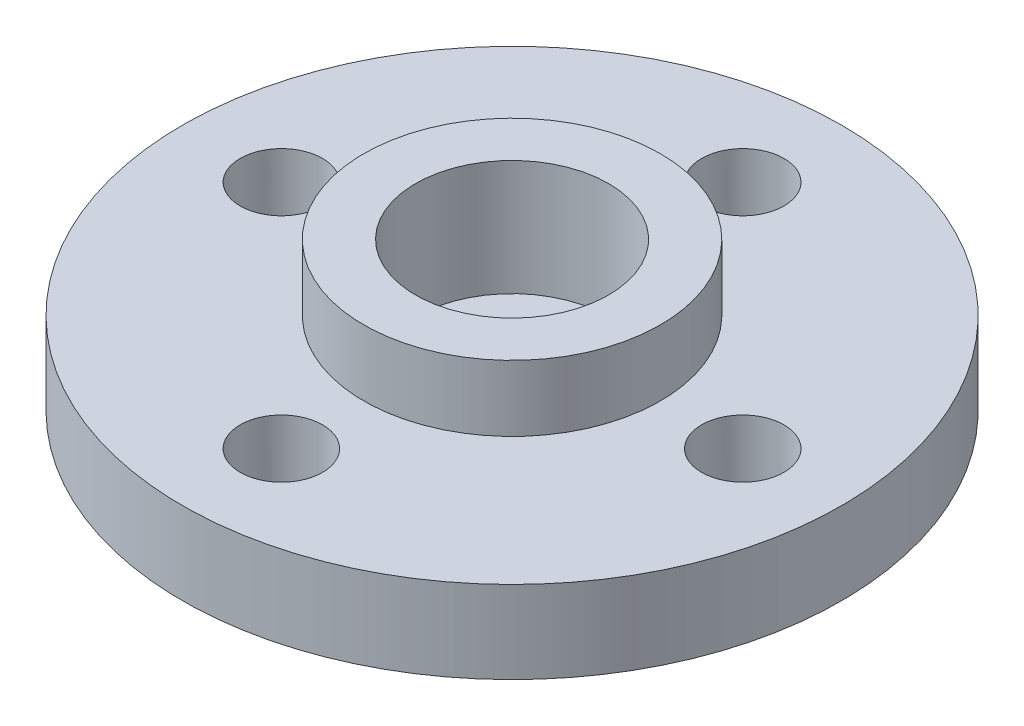
ISO-10303-21;
HEADER;
FILE_DESCRIPTION(('STEP AP214'),'2;1');
FILE_NAME('part.step','',(''),(''),'','','');
FILE_SCHEMA(('AUTOMOTIVE_DESIGN { 1 0 10303 214 1 1 1 1 }'));
ENDSEC;
DATA;
#1=APPLICATION_CONTEXT('core data for automotive mechanical design processes');
#2=APPLICATION_PROTOCOL_DEFINITION('international standard','automotive_design',2000,#1);
#3=PRODUCT_CONTEXT('',#1,'mechanical');
#4=PRODUCT('Part','Part','',(#3));
#5=PRODUCT_RELATED_PRODUCT_CATEGORY('part','',(#4));
#6=PRODUCT_DEFINITION_FORMATION('','',#4);
#7=PRODUCT_DEFINITION_CONTEXT('part definition',#1,'design');
#8=PRODUCT_DEFINITION('design','',#6,#7);
#9=PRODUCT_DEFINITION_SHAPE('','',#8);
#10=(LENGTH_UNIT() NAMED_UNIT(*) SI_UNIT(.MILLI.,.METRE.));
#11=(NAMED_UNIT(*) PLANE_ANGLE_UNIT() SI_UNIT($,.RADIAN.));
#12=(NAMED_UNIT(*) SI_UNIT($,.STERADIAN.) SOLID_ANGLE_UNIT());
#13=UNCERTAINTY_MEASURE_WITH_UNIT(LENGTH_MEASURE(1.E-05),#10,'distance_accuracy_value','');
#14=(GEOMETRIC_REPRESENTATION_CONTEXT(3) GLOBAL_UNCERTAINTY_ASSIGNED_CONTEXT((#13)) GLOBAL_UNIT_ASSIGNED_CONTEXT((#10,
#11,#12)) REPRESENTATION_CONTEXT('',''));
#15=CARTESIAN_POINT('',(0.,0.,0.));
#16=DIRECTION('',(0.,0.,1.));
#17=DIRECTION('',(1.,0.,0.));
#18=AXIS2_PLACEMENT_3D('',#15,#16,#17);
#19=CARTESIAN_POINT('',(0.,0.,-10.));
#20=DIRECTION('',(0.,-1.,0.));
#21=DIRECTION('',(0.,0.,-1.));
#22=AXIS2_PLACEMENT_3D('',#19,#20,#21);
#23=PLANE('',#22);
#24=CARTESIAN_POINT('',(7.,0.,0.));
#25=DIRECTION('',(0.,-1.,0.));
#26=DIRECTION('',(-1.,0.,0.));
#27=AXIS2_PLACEMENT_3D('',#24,#25,#26);
#28=CIRCLE('',#27,1.25);
#29=CARTESIAN_POINT('',(5.75,0.,0.));
#30=VERTEX_POINT('',#29);
#31=EDGE_CURVE('E70',#30,#30,#28,.T.);
#32=ORIENTED_EDGE('',*,*,#31,.F.);
#33=EDGE_LOOP('',(#32));
#34=FACE_BOUND('',#33,.T.);
#35=CARTESIAN_POINT('',(0.,0.,-7.));
#36=DIRECTION('',(0.,-1.,0.));
#37=DIRECTION('',(0.,0.,1.));
#38=AXIS2_PLACEMENT_3D('',#35,#36,#37);
#39=CIRCLE('',#38,1.25);
#40=CARTESIAN_POINT('',(0.,0.,-5.75));
#41=VERTEX_POINT('',#40);
#42=EDGE_CURVE('E78',#41,#41,#39,.T.);
#43=ORIENTED_EDGE('',*,*,#42,.F.);
#44=EDGE_LOOP('',(#43));
#45=FACE_BOUND('',#44,.T.);
#46=CARTESIAN_POINT('',(-7.,0.,0.));
#47=DIRECTION('',(0.,-1.,0.));
#48=DIRECTION('',(1.,0.,0.));
#49=AXIS2_PLACEMENT_3D('',#46,#47,#48);
#50=CIRCLE('',#49,1.25);
#51=CARTESIAN_POINT('',(-5.75,0.,0.));
#52=VERTEX_POINT('',#51);
#53=EDGE_CURVE('E71',#52,#52,#50,.T.);
#54=ORIENTED_EDGE('',*,*,#53,.F.);
#55=EDGE_LOOP('',(#54));
#56=FACE_BOUND('',#55,.T.);
#57=CARTESIAN_POINT('',(0.,0.,7.));
#58=DIRECTION('',(0.,-1.,0.));
#59=DIRECTION('',(0.,0.,-1.));
#60=AXIS2_PLACEMENT_3D('',#57,#58,#59);
#61=CIRCLE('',#60,1.25);
#62=CARTESIAN_POINT('',(0.,0.,5.75));
#63=VERTEX_POINT('',#62);
#64=EDGE_CURVE('E67',#63,#63,#61,.T.);
#65=ORIENTED_EDGE('',*,*,#64,.F.);
#66=EDGE_LOOP('',(#65));
#67=FACE_BOUND('',#66,.T.);
#68=CARTESIAN_POINT('',(0.,0.,0.));
#69=DIRECTION('',(0.,-1.,0.));
#70=DIRECTION('',(0.,0.,-1.));
#71=AXIS2_PLACEMENT_3D('',#68,#69,#70);
#72=CIRCLE('',#71,10.);
#73=CARTESIAN_POINT('',(0.,0.,-10.));
#74=VERTEX_POINT('',#73);
#75=EDGE_CURVE('E64',#74,#74,#72,.T.);
#76=ORIENTED_EDGE('',*,*,#75,.T.);
#77=EDGE_LOOP('',(#76));
#78=FACE_BOUND('',#77,.T.);
#79=CARTESIAN_POINT('',(0.,0.,0.));
#80=DIRECTION('',(0.,-1.,0.));
#81=DIRECTION('',(0.,0.,-1.));
#82=AXIS2_PLACEMENT_3D('',#79,#80,#81);
#83=CIRCLE('',#82,1.6);
#84=CARTESIAN_POINT('',(0.,0.,-1.6));
#85=VERTEX_POINT('',#84);
#86=EDGE_CURVE('E10',#85,#85,#83,.T.);
#87=ORIENTED_EDGE('',*,*,#86,.F.);
#88=EDGE_LOOP('',(#87));
#89=FACE_BOUND('',#88,.T.);
#90=ADVANCED_FACE('F36',(#34,#45,#56,#67,#78,#89),#23,.T.);
#91=CARTESIAN_POINT('',(0.,0.,0.));
#92=DIRECTION('',(0.,-1.,0.));
#93=DIRECTION('',(0.,0.,-1.));
#94=AXIS2_PLACEMENT_3D('',#91,#92,#93);
#95=CYLINDRICAL_SURFACE('',#94,1.6);
#96=ORIENTED_EDGE('',*,*,#86,.T.);
#97=EDGE_LOOP('',(#96));
#98=FACE_BOUND('',#97,.T.);
#99=CARTESIAN_POINT('',(0.,0.999999999999999,0.));
#100=DIRECTION('',(0.,-1.,0.));
#101=DIRECTION('',(0.,0.,-1.));
#102=AXIS2_PLACEMENT_3D('',#99,#100,#101);
#103=CIRCLE('',#102,1.6);
#104=CARTESIAN_POINT('',(0.,0.999999999999999,-1.6));
#105=VERTEX_POINT('',#104);
#106=EDGE_CURVE('E43',#105,#105,#103,.T.);
#107=ORIENTED_EDGE('',*,*,#106,.F.);
#108=EDGE_LOOP('',(#107));
#109=FACE_BOUND('',#108,.T.);
#110=ADVANCED_FACE('F117',(#98,#109),#95,.F.);
#111=CARTESIAN_POINT('',(0.,0.999999999999999,-1.6));
#112=DIRECTION('',(0.,1.,0.));
#113=DIRECTION('',(0.,0.,1.));
#114=AXIS2_PLACEMENT_3D('',#111,#112,#113);
#115=PLANE('',#114);
#116=ORIENTED_EDGE('',*,*,#106,.T.);
#117=EDGE_LOOP('',(#116));
#118=FACE_BOUND('',#117,.T.);
#119=CARTESIAN_POINT('',(0.,0.999999999999999,0.));
#120=DIRECTION('',(0.,-1.,0.));
#121=DIRECTION('',(0.,0.,-1.));
#122=AXIS2_PLACEMENT_3D('',#119,#120,#121);
#123=CIRCLE('',#122,2.93);
#124=CARTESIAN_POINT('',(0.,0.999999999999999,-2.93));
#125=VERTEX_POINT('',#124);
#126=EDGE_CURVE('E47',#125,#125,#123,.T.);
#127=ORIENTED_EDGE('',*,*,#126,.F.);
#128=EDGE_LOOP('',(#127));
#129=FACE_BOUND('',#128,.T.);
#130=ADVANCED_FACE('F124',(#118,#129),#115,.T.);
#131=CARTESIAN_POINT('',(0.,0.,0.));
#132=DIRECTION('',(0.,-1.,0.));
#133=DIRECTION('',(0.,0.,-1.));
#134=AXIS2_PLACEMENT_3D('',#131,#132,#133);
#135=CYLINDRICAL_SURFACE('',#134,2.93);
#136=ORIENTED_EDGE('',*,*,#126,.T.);
#137=EDGE_LOOP('',(#136));
#138=FACE_BOUND('',#137,.T.);
#139=CARTESIAN_POINT('',(0.,4.5,0.));
#140=DIRECTION('',(0.,-1.,0.));
#141=DIRECTION('',(0.,0.,-1.));
#142=AXIS2_PLACEMENT_3D('',#139,#140,#141);
#143=CIRCLE('',#142,2.93);
#144=CARTESIAN_POINT('',(0.,4.5,-2.93));
#145=VERTEX_POINT('',#144);
#146=EDGE_CURVE('E52',#145,#145,#143,.T.);
#147=ORIENTED_EDGE('',*,*,#146,.F.);
#148=EDGE_LOOP('',(#147));
#149=FACE_BOUND('',#148,.T.);
#150=ADVANCED_FACE('F151',(#138,#149),#135,.F.);
#151=CARTESIAN_POINT('',(0.,4.5,-2.93));
#152=DIRECTION('',(0.,1.,0.));
#153=DIRECTION('',(0.,0.,1.));
#154=AXIS2_PLACEMENT_3D('',#151,#152,#153);
#155=PLANE('',#154);
#156=ORIENTED_EDGE('',*,*,#146,.T.);
#157=EDGE_LOOP('',(#156));
#158=FACE_BOUND('',#157,.T.);
#159=CARTESIAN_POINT('',(0.,4.5,0.));
#160=DIRECTION('',(0.,-1.,0.));
#161=DIRECTION('',(0.,0.,-1.));
#162=AXIS2_PLACEMENT_3D('',#159,#160,#161);
#163=CIRCLE('',#162,4.5);
#164=CARTESIAN_POINT('',(0.,4.5,-4.5));
#165=VERTEX_POINT('',#164);
#166=EDGE_CURVE('E55',#165,#165,#163,.T.);
#167=ORIENTED_EDGE('',*,*,#166,.F.);
#168=EDGE_LOOP('',(#167));
#169=FACE_BOUND('',#168,.T.);
#170=ADVANCED_FACE('F147',(#158,#169),#155,.T.);
#171=CARTESIAN_POINT('',(0.,0.,0.));
#172=DIRECTION('',(0.,-1.,0.));
#173=DIRECTION('',(0.,0.,-1.));
#174=AXIS2_PLACEMENT_3D('',#171,#172,#173);
#175=CYLINDRICAL_SURFACE('',#174,4.5);
#176=ORIENTED_EDGE('',*,*,#166,.T.);
#177=EDGE_LOOP('',(#176));
#178=FACE_BOUND('',#177,.T.);
#179=CARTESIAN_POINT('',(0.,2.5,0.));
#180=DIRECTION('',(0.,-1.,0.));
#181=DIRECTION('',(0.,0.,-1.));
#182=AXIS2_PLACEMENT_3D('',#179,#180,#181);
#183=CIRCLE('',#182,4.5);
#184=CARTESIAN_POINT('',(0.,2.5,-4.5));
#185=VERTEX_POINT('',#184);
#186=EDGE_CURVE('E58',#185,#185,#183,.T.);
#187=ORIENTED_EDGE('',*,*,#186,.F.);
#188=EDGE_LOOP('',(#187));
#189=FACE_BOUND('',#188,.T.);
#190=ADVANCED_FACE('F96',(#178,#189),#175,.T.);
#191=CARTESIAN_POINT('',(0.,2.5,-4.5));
#192=DIRECTION('',(0.,1.,0.));
#193=DIRECTION('',(0.,0.,1.));
#194=AXIS2_PLACEMENT_3D('',#191,#192,#193);
#195=PLANE('',#194);
#196=CARTESIAN_POINT('',(7.,2.5,0.));
#197=DIRECTION('',(0.,1.,0.));
#198=DIRECTION('',(1.,0.,0.));
#199=AXIS2_PLACEMENT_3D('',#196,#197,#198);
#200=CIRCLE('',#199,1.25);
#201=CARTESIAN_POINT('',(8.25,2.5,0.));
#202=VERTEX_POINT('',#201);
#203=EDGE_CURVE('E81',#202,#202,#200,.T.);
#204=ORIENTED_EDGE('',*,*,#203,.F.);
#205=EDGE_LOOP('',(#204));
#206=FACE_BOUND('',#205,.T.);
#207=CARTESIAN_POINT('',(0.,2.5,-7.));
#208=DIRECTION('',(0.,1.,0.));
#209=DIRECTION('',(0.,0.,-1.));
#210=AXIS2_PLACEMENT_3D('',#207,#208,#209);
#211=CIRCLE('',#210,1.25);
#212=CARTESIAN_POINT('',(0.,2.5,-8.25));
#213=VERTEX_POINT('',#212);
#214=EDGE_CURVE('E74',#213,#213,#211,.T.);
#215=ORIENTED_EDGE('',*,*,#214,.F.);
#216=EDGE_LOOP('',(#215));
#217=FACE_BOUND('',#216,.T.);
#218=CARTESIAN_POINT('',(-7.,2.5,0.));
#219=DIRECTION('',(0.,1.,0.));
#220=DIRECTION('',(-1.,0.,0.));
#221=AXIS2_PLACEMENT_3D('',#218,#219,#220);
#222=CIRCLE('',#221,1.25);
#223=CARTESIAN_POINT('',(-8.25,2.5,0.));
#224=VERTEX_POINT('',#223);
#225=EDGE_CURVE('E75',#224,#224,#222,.T.);
#226=ORIENTED_EDGE('',*,*,#225,.F.);
#227=EDGE_LOOP('',(#226));
#228=FACE_BOUND('',#227,.T.);
#229=CARTESIAN_POINT('',(0.,2.5,7.));
#230=DIRECTION('',(0.,1.,0.));
#231=DIRECTION('',(0.,0.,1.));
#232=AXIS2_PLACEMENT_3D('',#229,#230,#231);
#233=CIRCLE('',#232,1.25);
#234=CARTESIAN_POINT('',(0.,2.5,8.25));
#235=VERTEX_POINT('',#234);
#236=EDGE_CURVE('E39',#235,#235,#233,.T.);
#237=ORIENTED_EDGE('',*,*,#236,.F.);
#238=EDGE_LOOP('',(#237));
#239=FACE_BOUND('',#238,.T.);
#240=ORIENTED_EDGE('',*,*,#186,.T.);
#241=EDGE_LOOP('',(#240));
#242=FACE_BOUND('',#241,.T.);
#243=CARTESIAN_POINT('',(0.,2.5,0.));
#244=DIRECTION('',(0.,-1.,0.));
#245=DIRECTION('',(0.,0.,-1.));
#246=AXIS2_PLACEMENT_3D('',#243,#244,#245);
#247=CIRCLE('',#246,10.);
#248=CARTESIAN_POINT('',(0.,2.5,-10.));
#249=VERTEX_POINT('',#248);
#250=EDGE_CURVE('E61',#249,#249,#247,.T.);
#251=ORIENTED_EDGE('',*,*,#250,.F.);
#252=EDGE_LOOP('',(#251));
#253=FACE_BOUND('',#252,.T.);
#254=ADVANCED_FACE('F92',(#206,#217,#228,#239,#242,#253),#195,.T.);
#255=CARTESIAN_POINT('',(0.,0.,0.));
#256=DIRECTION('',(0.,-1.,0.));
#257=DIRECTION('',(0.,0.,-1.));
#258=AXIS2_PLACEMENT_3D('',#255,#256,#257);
#259=CYLINDRICAL_SURFACE('',#258,10.);
#260=ORIENTED_EDGE('',*,*,#250,.T.);
#261=EDGE_LOOP('',(#260));
#262=FACE_BOUND('',#261,.T.);
#263=ORIENTED_EDGE('',*,*,#75,.F.);
#264=EDGE_LOOP('',(#263));
#265=FACE_BOUND('',#264,.T.);
#266=ADVANCED_FACE('F95',(#262,#265),#259,.T.);
#267=CARTESIAN_POINT('',(0.,0.,7.));
#268=DIRECTION('',(0.,-1.,0.));
#269=DIRECTION('',(0.,0.,-1.));
#270=AXIS2_PLACEMENT_3D('',#267,#268,#269);
#271=CYLINDRICAL_SURFACE('',#270,1.25);
#272=ORIENTED_EDGE('',*,*,#236,.T.);
#273=EDGE_LOOP('',(#272));
#274=FACE_BOUND('',#273,.T.);
#275=ORIENTED_EDGE('',*,*,#64,.T.);
#276=EDGE_LOOP('',(#275));
#277=FACE_BOUND('',#276,.T.);
#278=ADVANCED_FACE('F111',(#274,#277),#271,.F.);
#279=CARTESIAN_POINT('',(-7.,0.,0.));
#280=DIRECTION('',(0.,-1.,0.));
#281=DIRECTION('',(1.,0.,0.));
#282=AXIS2_PLACEMENT_3D('',#279,#280,#281);
#283=CYLINDRICAL_SURFACE('',#282,1.25);
#284=ORIENTED_EDGE('',*,*,#225,.T.);
#285=EDGE_LOOP('',(#284));
#286=FACE_BOUND('',#285,.T.);
#287=ORIENTED_EDGE('',*,*,#53,.T.);
#288=EDGE_LOOP('',(#287));
#289=FACE_BOUND('',#288,.T.);
#290=ADVANCED_FACE('F134',(#286,#289),#283,.F.);
#291=CARTESIAN_POINT('',(0.,0.,-7.));
#292=DIRECTION('',(0.,-1.,0.));
#293=DIRECTION('',(0.,0.,1.));
#294=AXIS2_PLACEMENT_3D('',#291,#292,#293);
#295=CYLINDRICAL_SURFACE('',#294,1.25);
#296=ORIENTED_EDGE('',*,*,#214,.T.);
#297=EDGE_LOOP('',(#296));
#298=FACE_BOUND('',#297,.T.);
#299=ORIENTED_EDGE('',*,*,#42,.T.);
#300=EDGE_LOOP('',(#299));
#301=FACE_BOUND('',#300,.T.);
#302=ADVANCED_FACE('F140',(#298,#301),#295,.F.);
#303=CARTESIAN_POINT('',(7.,0.,0.));
#304=DIRECTION('',(0.,-1.,0.));
#305=DIRECTION('',(-1.,0.,0.));
#306=AXIS2_PLACEMENT_3D('',#303,#304,#305);
#307=CYLINDRICAL_SURFACE('',#306,1.25);
#308=ORIENTED_EDGE('',*,*,#203,.T.);
#309=EDGE_LOOP('',(#308));
#310=FACE_BOUND('',#309,.T.);
#311=ORIENTED_EDGE('',*,*,#31,.T.);
#312=EDGE_LOOP('',(#311));
#313=FACE_BOUND('',#312,.T.);
#314=ADVANCED_FACE('F89',(#310,#313),#307,.F.);
#315=CLOSED_SHELL('',(#90,#110,#130,#150,#170,#190,#254,#266,#278,#290,#302,#314));
#316=MANIFOLD_SOLID_BREP('B2',#315);
#317=ADVANCED_BREP_SHAPE_REPRESENTATION('',(#18,#316),#14);
#318=SHAPE_DEFINITION_REPRESENTATION(#9,#317);
ENDSEC;
END-ISO-10303-21;
